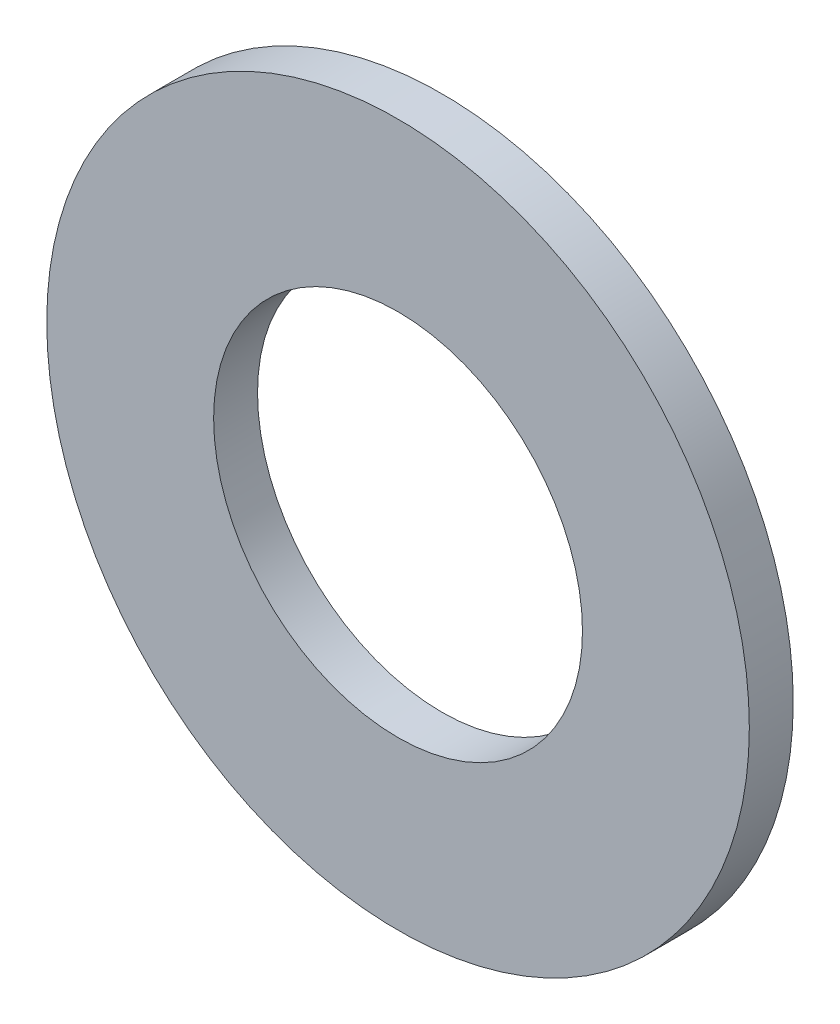
ISO-10303-21;
HEADER;
FILE_DESCRIPTION(('STEP AP214'),'2;1');
FILE_NAME('part.step','',(''),(''),'','','');
FILE_SCHEMA(('AUTOMOTIVE_DESIGN { 1 0 10303 214 1 1 1 1 }'));
ENDSEC;
DATA;
#1=APPLICATION_CONTEXT('core data for automotive mechanical design processes');
#2=APPLICATION_PROTOCOL_DEFINITION('international standard','automotive_design',2000,#1);
#3=PRODUCT_CONTEXT('',#1,'mechanical');
#4=PRODUCT('Part','Part','',(#3));
#5=PRODUCT_RELATED_PRODUCT_CATEGORY('part','',(#4));
#6=PRODUCT_DEFINITION_FORMATION('','',#4);
#7=PRODUCT_DEFINITION_CONTEXT('part definition',#1,'design');
#8=PRODUCT_DEFINITION('design','',#6,#7);
#9=PRODUCT_DEFINITION_SHAPE('','',#8);
#10=(LENGTH_UNIT() NAMED_UNIT(*) SI_UNIT(.MILLI.,.METRE.));
#11=(NAMED_UNIT(*) PLANE_ANGLE_UNIT() SI_UNIT($,.RADIAN.));
#12=(NAMED_UNIT(*) SI_UNIT($,.STERADIAN.) SOLID_ANGLE_UNIT());
#13=UNCERTAINTY_MEASURE_WITH_UNIT(LENGTH_MEASURE(1.E-05),#10,'distance_accuracy_value','');
#14=(GEOMETRIC_REPRESENTATION_CONTEXT(3) GLOBAL_UNCERTAINTY_ASSIGNED_CONTEXT((#13)) GLOBAL_UNIT_ASSIGNED_CONTEXT((#10,
#11,#12)) REPRESENTATION_CONTEXT('',''));
#15=CARTESIAN_POINT('',(0.,0.,0.));
#16=DIRECTION('',(0.,0.,1.));
#17=DIRECTION('',(1.,0.,0.));
#18=AXIS2_PLACEMENT_3D('',#15,#16,#17);
#19=CARTESIAN_POINT('',(0.,0.,0.5));
#20=DIRECTION('',(0.,0.,1.));
#21=DIRECTION('',(1.,0.,0.));
#22=AXIS2_PLACEMENT_3D('',#19,#20,#21);
#23=PLANE('',#22);
#24=CARTESIAN_POINT('',(0.,0.,0.5));
#25=DIRECTION('',(0.,0.,1.));
#26=DIRECTION('',(1.,0.,0.));
#27=AXIS2_PLACEMENT_3D('',#24,#25,#26);
#28=CIRCLE('',#27,4.);
#29=CARTESIAN_POINT('',(4.,0.,0.5));
#30=VERTEX_POINT('',#29);
#31=EDGE_CURVE('E10',#30,#30,#28,.T.);
#32=ORIENTED_EDGE('',*,*,#31,.T.);
#33=EDGE_LOOP('',(#32));
#34=FACE_BOUND('',#33,.T.);
#35=CARTESIAN_POINT('',(0.,0.,0.5));
#36=DIRECTION('',(0.,0.,1.));
#37=DIRECTION('',(1.,0.,0.));
#38=AXIS2_PLACEMENT_3D('',#35,#36,#37);
#39=CIRCLE('',#38,2.1);
#40=CARTESIAN_POINT('',(2.1,0.,0.5));
#41=VERTEX_POINT('',#40);
#42=EDGE_CURVE('E48',#41,#41,#39,.T.);
#43=ORIENTED_EDGE('',*,*,#42,.F.);
#44=EDGE_LOOP('',(#43));
#45=FACE_BOUND('',#44,.T.);
#46=ADVANCED_FACE('F40',(#34,#45),#23,.T.);
#47=CARTESIAN_POINT('',(0.,0.,0.));
#48=DIRECTION('',(0.,0.,1.));
#49=DIRECTION('',(1.,0.,0.));
#50=AXIS2_PLACEMENT_3D('',#47,#48,#49);
#51=PLANE('',#50);
#52=CARTESIAN_POINT('',(0.,0.,0.));
#53=DIRECTION('',(0.,0.,1.));
#54=DIRECTION('',(1.,0.,0.));
#55=AXIS2_PLACEMENT_3D('',#52,#53,#54);
#56=CIRCLE('',#55,4.);
#57=CARTESIAN_POINT('',(4.,0.,0.));
#58=VERTEX_POINT('',#57);
#59=EDGE_CURVE('E41',#58,#58,#56,.T.);
#60=ORIENTED_EDGE('',*,*,#59,.F.);
#61=EDGE_LOOP('',(#60));
#62=FACE_BOUND('',#61,.T.);
#63=CARTESIAN_POINT('',(0.,0.,0.));
#64=DIRECTION('',(0.,0.,1.));
#65=DIRECTION('',(1.,0.,0.));
#66=AXIS2_PLACEMENT_3D('',#63,#64,#65);
#67=CIRCLE('',#66,2.1);
#68=CARTESIAN_POINT('',(2.1,0.,0.));
#69=VERTEX_POINT('',#68);
#70=EDGE_CURVE('E49',#69,#69,#67,.T.);
#71=ORIENTED_EDGE('',*,*,#70,.T.);
#72=EDGE_LOOP('',(#71));
#73=FACE_BOUND('',#72,.T.);
#74=ADVANCED_FACE('F58',(#62,#73),#51,.F.);
#75=CARTESIAN_POINT('',(0.,0.,0.5));
#76=DIRECTION('',(0.,0.,-1.));
#77=DIRECTION('',(-1.,0.,0.));
#78=AXIS2_PLACEMENT_3D('',#75,#76,#77);
#79=CYLINDRICAL_SURFACE('',#78,4.);
#80=ORIENTED_EDGE('',*,*,#31,.F.);
#81=EDGE_LOOP('',(#80));
#82=FACE_BOUND('',#81,.T.);
#83=ORIENTED_EDGE('',*,*,#59,.T.);
#84=EDGE_LOOP('',(#83));
#85=FACE_BOUND('',#84,.T.);
#86=ADVANCED_FACE('F39',(#82,#85),#79,.T.);
#87=CARTESIAN_POINT('',(0.,0.,0.5));
#88=DIRECTION('',(0.,0.,-1.));
#89=DIRECTION('',(-1.,0.,0.));
#90=AXIS2_PLACEMENT_3D('',#87,#88,#89);
#91=CYLINDRICAL_SURFACE('',#90,2.1);
#92=ORIENTED_EDGE('',*,*,#42,.T.);
#93=EDGE_LOOP('',(#92));
#94=FACE_BOUND('',#93,.T.);
#95=ORIENTED_EDGE('',*,*,#70,.F.);
#96=EDGE_LOOP('',(#95));
#97=FACE_BOUND('',#96,.T.);
#98=ADVANCED_FACE('F57',(#94,#97),#91,.F.);
#99=CLOSED_SHELL('',(#46,#74,#86,#98));
#100=MANIFOLD_SOLID_BREP('B2',#99);
#101=ADVANCED_BREP_SHAPE_REPRESENTATION('',(#18,#100),#14);
#102=SHAPE_DEFINITION_REPRESENTATION(#9,#101);
ENDSEC;
END-ISO-10303-21;
